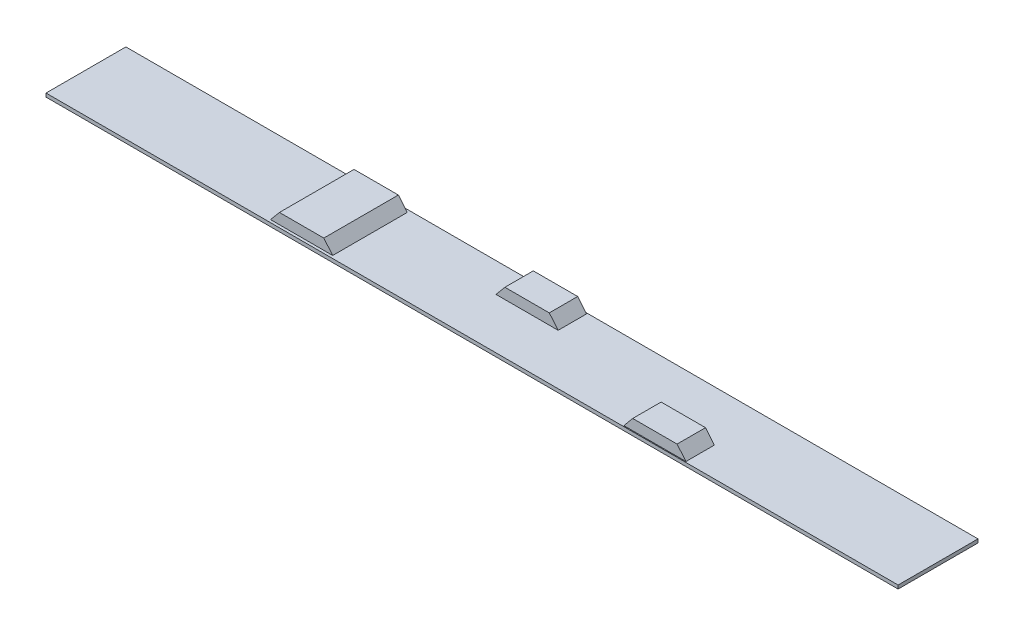
ISO-10303-21;
HEADER;
FILE_DESCRIPTION(('STEP AP214'),'2;1');
FILE_NAME('part.step','',(''),(''),'','','');
FILE_SCHEMA(('AUTOMOTIVE_DESIGN { 1 0 10303 214 1 1 1 1 }'));
ENDSEC;
DATA;
#1=APPLICATION_CONTEXT('core data for automotive mechanical design processes');
#2=APPLICATION_PROTOCOL_DEFINITION('international standard','automotive_design',2000,#1);
#3=PRODUCT_CONTEXT('',#1,'mechanical');
#4=PRODUCT('Part','Part','',(#3));
#5=PRODUCT_RELATED_PRODUCT_CATEGORY('part','',(#4));
#6=PRODUCT_DEFINITION_FORMATION('','',#4);
#7=PRODUCT_DEFINITION_CONTEXT('part definition',#1,'design');
#8=PRODUCT_DEFINITION('design','',#6,#7);
#9=PRODUCT_DEFINITION_SHAPE('','',#8);
#10=(LENGTH_UNIT() NAMED_UNIT(*) SI_UNIT(.MILLI.,.METRE.));
#11=(NAMED_UNIT(*) PLANE_ANGLE_UNIT() SI_UNIT($,.RADIAN.));
#12=(NAMED_UNIT(*) SI_UNIT($,.STERADIAN.) SOLID_ANGLE_UNIT());
#13=UNCERTAINTY_MEASURE_WITH_UNIT(LENGTH_MEASURE(1.E-05),#10,'distance_accuracy_value','');
#14=(GEOMETRIC_REPRESENTATION_CONTEXT(3) GLOBAL_UNCERTAINTY_ASSIGNED_CONTEXT((#13)) GLOBAL_UNIT_ASSIGNED_CONTEXT((#10,
#11,#12)) REPRESENTATION_CONTEXT('',''));
#15=CARTESIAN_POINT('',(0.,0.,0.));
#16=DIRECTION('',(0.,0.,1.));
#17=DIRECTION('',(1.,0.,0.));
#18=AXIS2_PLACEMENT_3D('',#15,#16,#17);
#19=CARTESIAN_POINT('',(0.,10.,0.));
#20=DIRECTION('',(0.,-1.,0.));
#21=DIRECTION('',(0.,0.,-1.));
#22=AXIS2_PLACEMENT_3D('',#19,#20,#21);
#23=PLANE('',#22);
#24=DIRECTION('',(1.,0.,0.));
#25=VECTOR('',#24,1.);
#26=CARTESIAN_POINT('',(425.,10.,110.));
#27=LINE('',#26,#25);
#28=CARTESIAN_POINT('',(425.,10.,110.));
#29=VERTEX_POINT('',#28);
#30=CARTESIAN_POINT('',(600.,10.,110.));
#31=VERTEX_POINT('',#30);
#32=EDGE_CURVE('E253',#29,#31,#27,.T.);
#33=ORIENTED_EDGE('',*,*,#32,.F.);
#34=DIRECTION('',(0.,0.,-1.));
#35=VECTOR('',#34,1.);
#36=CARTESIAN_POINT('',(425.,10.,110.));
#37=LINE('',#36,#35);
#38=CARTESIAN_POINT('',(425.,10.,30.));
#39=VERTEX_POINT('',#38);
#40=EDGE_CURVE('E267',#29,#39,#37,.T.);
#41=ORIENTED_EDGE('',*,*,#40,.T.);
#42=DIRECTION('',(1.,0.,0.));
#43=VECTOR('',#42,1.);
#44=CARTESIAN_POINT('',(425.,10.,30.));
#45=LINE('',#44,#43);
#46=CARTESIAN_POINT('',(600.,10.,30.));
#47=VERTEX_POINT('',#46);
#48=EDGE_CURVE('E244',#39,#47,#45,.T.);
#49=ORIENTED_EDGE('',*,*,#48,.T.);
#50=DIRECTION('',(0.,0.,-1.));
#51=VECTOR('',#50,1.);
#52=CARTESIAN_POINT('',(600.,10.,110.));
#53=LINE('',#52,#51);
#54=EDGE_CURVE('E290',#31,#47,#53,.T.);
#55=ORIENTED_EDGE('',*,*,#54,.F.);
#56=EDGE_LOOP('',(#33,#41,#49,#55));
#57=FACE_BOUND('',#56,.T.);
#58=DIRECTION('',(0.,0.,-1.));
#59=VECTOR('',#58,1.);
#60=CARTESIAN_POINT('',(1200.,10.,112.5));
#61=LINE('',#60,#59);
#62=CARTESIAN_POINT('',(1200.,10.,112.5));
#63=VERTEX_POINT('',#62);
#64=CARTESIAN_POINT('',(1200.,10.,-112.5));
#65=VERTEX_POINT('',#64);
#66=EDGE_CURVE('E294',#63,#65,#61,.T.);
#67=ORIENTED_EDGE('',*,*,#66,.T.);
#68=DIRECTION('',(-1.,0.,0.));
#69=VECTOR('',#68,1.);
#70=CARTESIAN_POINT('',(-1200.,10.,-112.5));
#71=LINE('',#70,#69);
#72=CARTESIAN_POINT('',(-1200.,10.,-112.5));
#73=VERTEX_POINT('',#72);
#74=EDGE_CURVE('E298',#65,#73,#71,.T.);
#75=ORIENTED_EDGE('',*,*,#74,.T.);
#76=DIRECTION('',(0.,0.,1.));
#77=VECTOR('',#76,1.);
#78=CARTESIAN_POINT('',(-1200.,10.,112.5));
#79=LINE('',#78,#77);
#80=CARTESIAN_POINT('',(-1200.,10.,112.5));
#81=VERTEX_POINT('',#80);
#82=EDGE_CURVE('E302',#73,#81,#79,.T.);
#83=ORIENTED_EDGE('',*,*,#82,.T.);
#84=DIRECTION('',(1.,0.,0.));
#85=VECTOR('',#84,1.);
#86=CARTESIAN_POINT('',(-1200.,10.,112.5));
#87=LINE('',#86,#85);
#88=EDGE_CURVE('E305',#81,#63,#87,.T.);
#89=ORIENTED_EDGE('',*,*,#88,.T.);
#90=EDGE_LOOP('',(#67,#75,#83,#89));
#91=FACE_BOUND('',#90,.T.);
#92=DIRECTION('',(0.,0.,1.));
#93=VECTOR('',#92,1.);
#94=CARTESIAN_POINT('',(-75.,9.99999999999651,-110.));
#95=LINE('',#94,#93);
#96=CARTESIAN_POINT('',(-74.9999999999971,10.,-110.));
#97=VERTEX_POINT('',#96);
#98=CARTESIAN_POINT('',(-75.,10.,-30.));
#99=VERTEX_POINT('',#98);
#100=EDGE_CURVE('E69',#97,#99,#95,.T.);
#101=ORIENTED_EDGE('',*,*,#100,.F.);
#102=DIRECTION('',(1.,0.,0.));
#103=VECTOR('',#102,1.);
#104=CARTESIAN_POINT('',(-75.,9.99999999999651,-110.));
#105=LINE('',#104,#103);
#106=CARTESIAN_POINT('',(99.9999999999971,10.,-110.));
#107=VERTEX_POINT('',#106);
#108=EDGE_CURVE('E215',#97,#107,#105,.T.);
#109=ORIENTED_EDGE('',*,*,#108,.T.);
#110=DIRECTION('',(0.,0.,1.));
#111=VECTOR('',#110,1.);
#112=CARTESIAN_POINT('',(100.,9.99999999999651,-110.));
#113=LINE('',#112,#111);
#114=CARTESIAN_POINT('',(100.,9.99999999999651,-30.));
#115=VERTEX_POINT('',#114);
#116=EDGE_CURVE('E248',#107,#115,#113,.T.);
#117=ORIENTED_EDGE('',*,*,#116,.T.);
#118=DIRECTION('',(1.,0.,0.));
#119=VECTOR('',#118,1.);
#120=CARTESIAN_POINT('',(-75.,9.99999999999651,-30.));
#121=LINE('',#120,#119);
#122=EDGE_CURVE('E230',#99,#115,#121,.T.);
#123=ORIENTED_EDGE('',*,*,#122,.F.);
#124=EDGE_LOOP('',(#101,#109,#117,#123));
#125=FACE_BOUND('',#124,.T.);
#126=DIRECTION('',(1.,0.,0.));
#127=VECTOR('',#126,1.);
#128=CARTESIAN_POINT('',(-575.,9.99999999999651,-105.));
#129=LINE('',#128,#127);
#130=CARTESIAN_POINT('',(-575.,9.99999999999651,-105.));
#131=VERTEX_POINT('',#130);
#132=CARTESIAN_POINT('',(-400.,9.99999999999302,-105.));
#133=VERTEX_POINT('',#132);
#134=EDGE_CURVE('E194',#131,#133,#129,.T.);
#135=ORIENTED_EDGE('',*,*,#134,.T.);
#136=DIRECTION('',(0.,0.,1.));
#137=VECTOR('',#136,1.);
#138=CARTESIAN_POINT('',(-400.,9.99999999999302,-105.));
#139=LINE('',#138,#137);
#140=CARTESIAN_POINT('',(-400.,9.99999999999302,105.));
#141=VERTEX_POINT('',#140);
#142=EDGE_CURVE('E205',#133,#141,#139,.T.);
#143=ORIENTED_EDGE('',*,*,#142,.T.);
#144=DIRECTION('',(1.,0.,0.));
#145=VECTOR('',#144,1.);
#146=CARTESIAN_POINT('',(-575.,9.99999999999651,105.));
#147=LINE('',#146,#145);
#148=CARTESIAN_POINT('',(-575.,10.,105.));
#149=VERTEX_POINT('',#148);
#150=EDGE_CURVE('E176',#149,#141,#147,.T.);
#151=ORIENTED_EDGE('',*,*,#150,.F.);
#152=DIRECTION('',(0.,0.,1.));
#153=VECTOR('',#152,1.);
#154=CARTESIAN_POINT('',(-575.,9.99999999999651,-105.));
#155=LINE('',#154,#153);
#156=EDGE_CURVE('E169',#131,#149,#155,.T.);
#157=ORIENTED_EDGE('',*,*,#156,.F.);
#158=EDGE_LOOP('',(#135,#143,#151,#157));
#159=FACE_BOUND('',#158,.T.);
#160=ADVANCED_FACE('F45',(#57,#91,#125,#159),#23,.F.);
#161=CARTESIAN_POINT('',(1200.,10.,112.5));
#162=DIRECTION('',(-1.,0.,0.));
#163=DIRECTION('',(0.,0.,1.));
#164=AXIS2_PLACEMENT_3D('',#161,#162,#163);
#165=PLANE('',#164);
#166=DIRECTION('',(0.,0.,-1.));
#167=VECTOR('',#166,1.);
#168=CARTESIAN_POINT('',(1200.,0.,112.5));
#169=LINE('',#168,#167);
#170=CARTESIAN_POINT('',(1200.,0.,112.5));
#171=VERTEX_POINT('',#170);
#172=CARTESIAN_POINT('',(1200.,0.,-112.5));
#173=VERTEX_POINT('',#172);
#174=EDGE_CURVE('E293',#171,#173,#169,.T.);
#175=ORIENTED_EDGE('',*,*,#174,.T.);
#176=DIRECTION('',(0.,-1.,0.));
#177=VECTOR('',#176,1.);
#178=CARTESIAN_POINT('',(1200.,10.,-112.5));
#179=LINE('',#178,#177);
#180=EDGE_CURVE('E11',#65,#173,#179,.T.);
#181=ORIENTED_EDGE('',*,*,#180,.F.);
#182=ORIENTED_EDGE('',*,*,#66,.F.);
#183=DIRECTION('',(0.,-1.,0.));
#184=VECTOR('',#183,1.);
#185=CARTESIAN_POINT('',(1200.,10.,112.5));
#186=LINE('',#185,#184);
#187=EDGE_CURVE('E308',#63,#171,#186,.T.);
#188=ORIENTED_EDGE('',*,*,#187,.T.);
#189=EDGE_LOOP('',(#175,#181,#182,#188));
#190=FACE_BOUND('',#189,.T.);
#191=ADVANCED_FACE('F47',(#190),#165,.F.);
#192=CARTESIAN_POINT('',(-1200.,10.,-112.5));
#193=DIRECTION('',(0.,0.,1.));
#194=DIRECTION('',(1.,0.,0.));
#195=AXIS2_PLACEMENT_3D('',#192,#193,#194);
#196=PLANE('',#195);
#197=DIRECTION('',(-1.,0.,0.));
#198=VECTOR('',#197,1.);
#199=CARTESIAN_POINT('',(-1200.,0.,-112.5));
#200=LINE('',#199,#198);
#201=CARTESIAN_POINT('',(-1200.,0.,-112.5));
#202=VERTEX_POINT('',#201);
#203=EDGE_CURVE('E312',#173,#202,#200,.T.);
#204=ORIENTED_EDGE('',*,*,#203,.T.);
#205=DIRECTION('',(0.,-1.,0.));
#206=VECTOR('',#205,1.);
#207=CARTESIAN_POINT('',(-1200.,10.,-112.5));
#208=LINE('',#207,#206);
#209=EDGE_CURVE('E54',#73,#202,#208,.T.);
#210=ORIENTED_EDGE('',*,*,#209,.F.);
#211=ORIENTED_EDGE('',*,*,#74,.F.);
#212=ORIENTED_EDGE('',*,*,#180,.T.);
#213=EDGE_LOOP('',(#204,#210,#211,#212));
#214=FACE_BOUND('',#213,.T.);
#215=ADVANCED_FACE('F347',(#214),#196,.F.);
#216=CARTESIAN_POINT('',(-1200.,10.,112.5));
#217=DIRECTION('',(1.,0.,0.));
#218=DIRECTION('',(0.,0.,-1.));
#219=AXIS2_PLACEMENT_3D('',#216,#217,#218);
#220=PLANE('',#219);
#221=DIRECTION('',(0.,0.,1.));
#222=VECTOR('',#221,1.);
#223=CARTESIAN_POINT('',(-1200.,0.,112.5));
#224=LINE('',#223,#222);
#225=CARTESIAN_POINT('',(-1200.,0.,112.5));
#226=VERTEX_POINT('',#225);
#227=EDGE_CURVE('E315',#202,#226,#224,.T.);
#228=ORIENTED_EDGE('',*,*,#227,.T.);
#229=DIRECTION('',(0.,-1.,0.));
#230=VECTOR('',#229,1.);
#231=CARTESIAN_POINT('',(-1200.,10.,112.5));
#232=LINE('',#231,#230);
#233=EDGE_CURVE('E323',#81,#226,#232,.T.);
#234=ORIENTED_EDGE('',*,*,#233,.F.);
#235=ORIENTED_EDGE('',*,*,#82,.F.);
#236=ORIENTED_EDGE('',*,*,#209,.T.);
#237=EDGE_LOOP('',(#228,#234,#235,#236));
#238=FACE_BOUND('',#237,.T.);
#239=ADVANCED_FACE('F332',(#238),#220,.F.);
#240=CARTESIAN_POINT('',(-1200.,10.,112.5));
#241=DIRECTION('',(0.,0.,-1.));
#242=DIRECTION('',(-1.,0.,0.));
#243=AXIS2_PLACEMENT_3D('',#240,#241,#242);
#244=PLANE('',#243);
#245=DIRECTION('',(1.,0.,0.));
#246=VECTOR('',#245,1.);
#247=CARTESIAN_POINT('',(-1200.,0.,112.5));
#248=LINE('',#247,#246);
#249=EDGE_CURVE('E299',#226,#171,#248,.T.);
#250=ORIENTED_EDGE('',*,*,#249,.T.);
#251=ORIENTED_EDGE('',*,*,#187,.F.);
#252=ORIENTED_EDGE('',*,*,#88,.F.);
#253=ORIENTED_EDGE('',*,*,#233,.T.);
#254=EDGE_LOOP('',(#250,#251,#252,#253));
#255=FACE_BOUND('',#254,.T.);
#256=ADVANCED_FACE('F341',(#255),#244,.F.);
#257=CARTESIAN_POINT('',(0.,0.,0.));
#258=DIRECTION('',(0.,-1.,0.));
#259=DIRECTION('',(0.,0.,-1.));
#260=AXIS2_PLACEMENT_3D('',#257,#258,#259);
#261=PLANE('',#260);
#262=ORIENTED_EDGE('',*,*,#174,.F.);
#263=ORIENTED_EDGE('',*,*,#249,.F.);
#264=ORIENTED_EDGE('',*,*,#227,.F.);
#265=ORIENTED_EDGE('',*,*,#203,.F.);
#266=EDGE_LOOP('',(#262,#263,#264,#265));
#267=FACE_BOUND('',#266,.T.);
#268=ADVANCED_FACE('F338',(#267),#261,.T.);
#269=CARTESIAN_POINT('',(575.,40.,110.));
#270=DIRECTION('',(-0.768221279597376,-0.64018439966448,0.));
#271=DIRECTION('',(0.64018439966448,-0.768221279597376,0.));
#272=AXIS2_PLACEMENT_3D('',#269,#270,#271);
#273=PLANE('',#272);
#274=DIRECTION('',(-0.64018439966448,0.768221279597375,0.));
#275=VECTOR('',#274,1.);
#276=CARTESIAN_POINT('',(575.,40.,30.));
#277=LINE('',#276,#275);
#278=CARTESIAN_POINT('',(575.,40.,30.));
#279=VERTEX_POINT('',#278);
#280=EDGE_CURVE('E271',#47,#279,#277,.T.);
#281=ORIENTED_EDGE('',*,*,#280,.T.);
#282=DIRECTION('',(0.,0.,-1.));
#283=VECTOR('',#282,1.);
#284=CARTESIAN_POINT('',(575.,40.,110.));
#285=LINE('',#284,#283);
#286=CARTESIAN_POINT('',(575.,40.,110.));
#287=VERTEX_POINT('',#286);
#288=EDGE_CURVE('E286',#287,#279,#285,.T.);
#289=ORIENTED_EDGE('',*,*,#288,.F.);
#290=DIRECTION('',(-0.64018439966448,0.768221279597375,0.));
#291=VECTOR('',#290,1.);
#292=CARTESIAN_POINT('',(575.,40.,110.));
#293=LINE('',#292,#291);
#294=EDGE_CURVE('E257',#31,#287,#293,.T.);
#295=ORIENTED_EDGE('',*,*,#294,.F.);
#296=ORIENTED_EDGE('',*,*,#54,.T.);
#297=EDGE_LOOP('',(#281,#289,#295,#296));
#298=FACE_BOUND('',#297,.T.);
#299=ADVANCED_FACE('F362',(#298),#273,.F.);
#300=CARTESIAN_POINT('',(450.,40.,110.));
#301=DIRECTION('',(0.,-1.,0.));
#302=DIRECTION('',(0.,0.,-1.));
#303=AXIS2_PLACEMENT_3D('',#300,#301,#302);
#304=PLANE('',#303);
#305=DIRECTION('',(-1.,0.,0.));
#306=VECTOR('',#305,1.);
#307=CARTESIAN_POINT('',(450.,40.,30.));
#308=LINE('',#307,#306);
#309=CARTESIAN_POINT('',(450.,40.,30.));
#310=VERTEX_POINT('',#309);
#311=EDGE_CURVE('E274',#279,#310,#308,.T.);
#312=ORIENTED_EDGE('',*,*,#311,.T.);
#313=DIRECTION('',(0.,0.,-1.));
#314=VECTOR('',#313,1.);
#315=CARTESIAN_POINT('',(450.,40.,110.));
#316=LINE('',#315,#314);
#317=CARTESIAN_POINT('',(450.,40.,110.));
#318=VERTEX_POINT('',#317);
#319=EDGE_CURVE('E282',#318,#310,#316,.T.);
#320=ORIENTED_EDGE('',*,*,#319,.F.);
#321=DIRECTION('',(-1.,0.,0.));
#322=VECTOR('',#321,1.);
#323=CARTESIAN_POINT('',(450.,40.,110.));
#324=LINE('',#323,#322);
#325=EDGE_CURVE('E261',#287,#318,#324,.T.);
#326=ORIENTED_EDGE('',*,*,#325,.F.);
#327=ORIENTED_EDGE('',*,*,#288,.T.);
#328=EDGE_LOOP('',(#312,#320,#326,#327));
#329=FACE_BOUND('',#328,.T.);
#330=ADVANCED_FACE('F381',(#329),#304,.F.);
#331=CARTESIAN_POINT('',(425.,10.,110.));
#332=DIRECTION('',(0.768221279597376,-0.640184399664479,0.));
#333=DIRECTION('',(0.640184399664479,0.768221279597376,0.));
#334=AXIS2_PLACEMENT_3D('',#331,#332,#333);
#335=PLANE('',#334);
#336=DIRECTION('',(-0.640184399664479,-0.768221279597376,0.));
#337=VECTOR('',#336,1.);
#338=CARTESIAN_POINT('',(425.,10.,30.));
#339=LINE('',#338,#337);
#340=EDGE_CURVE('E258',#310,#39,#339,.T.);
#341=ORIENTED_EDGE('',*,*,#340,.T.);
#342=ORIENTED_EDGE('',*,*,#40,.F.);
#343=DIRECTION('',(-0.640184399664479,-0.768221279597376,0.));
#344=VECTOR('',#343,1.);
#345=CARTESIAN_POINT('',(425.,10.,110.));
#346=LINE('',#345,#344);
#347=EDGE_CURVE('E264',#318,#29,#346,.T.);
#348=ORIENTED_EDGE('',*,*,#347,.F.);
#349=ORIENTED_EDGE('',*,*,#319,.T.);
#350=EDGE_LOOP('',(#341,#342,#348,#349));
#351=FACE_BOUND('',#350,.T.);
#352=ADVANCED_FACE('F388',(#351),#335,.F.);
#353=CARTESIAN_POINT('',(0.,0.,110.));
#354=DIRECTION('',(0.,0.,-1.));
#355=DIRECTION('',(-1.,0.,0.));
#356=AXIS2_PLACEMENT_3D('',#353,#354,#355);
#357=PLANE('',#356);
#358=ORIENTED_EDGE('',*,*,#32,.T.);
#359=ORIENTED_EDGE('',*,*,#294,.T.);
#360=ORIENTED_EDGE('',*,*,#325,.T.);
#361=ORIENTED_EDGE('',*,*,#347,.T.);
#362=EDGE_LOOP('',(#358,#359,#360,#361));
#363=FACE_BOUND('',#362,.T.);
#364=ADVANCED_FACE('F395',(#363),#357,.F.);
#365=CARTESIAN_POINT('',(0.,0.,30.));
#366=DIRECTION('',(0.,0.,-1.));
#367=DIRECTION('',(-1.,0.,0.));
#368=AXIS2_PLACEMENT_3D('',#365,#366,#367);
#369=PLANE('',#368);
#370=ORIENTED_EDGE('',*,*,#48,.F.);
#371=ORIENTED_EDGE('',*,*,#340,.F.);
#372=ORIENTED_EDGE('',*,*,#311,.F.);
#373=ORIENTED_EDGE('',*,*,#280,.F.);
#374=EDGE_LOOP('',(#370,#371,#372,#373));
#375=FACE_BOUND('',#374,.T.);
#376=ADVANCED_FACE('F403',(#375),#369,.T.);
#377=CARTESIAN_POINT('',(-50.,39.9999999999965,-110.));
#378=DIRECTION('',(-0.768221279597376,0.640184399664479,0.));
#379=DIRECTION('',(-0.640184399664479,-0.768221279597376,0.));
#380=AXIS2_PLACEMENT_3D('',#377,#378,#379);
#381=PLANE('',#380);
#382=DIRECTION('',(-0.640184399664479,-0.768221279597376,0.));
#383=VECTOR('',#382,1.);
#384=CARTESIAN_POINT('',(-50.,39.9999999999965,-30.));
#385=LINE('',#384,#383);
#386=CARTESIAN_POINT('',(-50.,39.9999999999965,-30.));
#387=VERTEX_POINT('',#386);
#388=EDGE_CURVE('E204',#387,#99,#385,.T.);
#389=ORIENTED_EDGE('',*,*,#388,.F.);
#390=DIRECTION('',(0.,0.,1.));
#391=VECTOR('',#390,1.);
#392=CARTESIAN_POINT('',(-50.,39.9999999999965,-110.));
#393=LINE('',#392,#391);
#394=CARTESIAN_POINT('',(-50.,39.9999999999965,-110.));
#395=VERTEX_POINT('',#394);
#396=EDGE_CURVE('E241',#395,#387,#393,.T.);
#397=ORIENTED_EDGE('',*,*,#396,.F.);
#398=DIRECTION('',(-0.640184399664479,-0.768221279597376,0.));
#399=VECTOR('',#398,1.);
#400=CARTESIAN_POINT('',(-50.,39.9999999999965,-110.));
#401=LINE('',#400,#399);
#402=EDGE_CURVE('E211',#395,#97,#401,.T.);
#403=ORIENTED_EDGE('',*,*,#402,.T.);
#404=ORIENTED_EDGE('',*,*,#100,.T.);
#405=EDGE_LOOP('',(#389,#397,#403,#404));
#406=FACE_BOUND('',#405,.T.);
#407=ADVANCED_FACE('F411',(#406),#381,.T.);
#408=CARTESIAN_POINT('',(75.,39.9999999999965,-110.));
#409=DIRECTION('',(0.,1.,0.));
#410=DIRECTION('',(0.,0.,1.));
#411=AXIS2_PLACEMENT_3D('',#408,#409,#410);
#412=PLANE('',#411);
#413=DIRECTION('',(-1.,0.,0.));
#414=VECTOR('',#413,1.);
#415=CARTESIAN_POINT('',(75.,39.9999999999965,-30.));
#416=LINE('',#415,#414);
#417=CARTESIAN_POINT('',(75.,39.9999999999965,-30.));
#418=VERTEX_POINT('',#417);
#419=EDGE_CURVE('E216',#418,#387,#416,.T.);
#420=ORIENTED_EDGE('',*,*,#419,.F.);
#421=DIRECTION('',(0.,0.,1.));
#422=VECTOR('',#421,1.);
#423=CARTESIAN_POINT('',(75.,39.9999999999965,-110.));
#424=LINE('',#423,#422);
#425=CARTESIAN_POINT('',(75.,39.9999999999965,-110.));
#426=VERTEX_POINT('',#425);
#427=EDGE_CURVE('E245',#426,#418,#424,.T.);
#428=ORIENTED_EDGE('',*,*,#427,.F.);
#429=DIRECTION('',(-1.,0.,0.));
#430=VECTOR('',#429,1.);
#431=CARTESIAN_POINT('',(75.,39.9999999999965,-110.));
#432=LINE('',#431,#430);
#433=EDGE_CURVE('E223',#426,#395,#432,.T.);
#434=ORIENTED_EDGE('',*,*,#433,.T.);
#435=ORIENTED_EDGE('',*,*,#396,.T.);
#436=EDGE_LOOP('',(#420,#428,#434,#435));
#437=FACE_BOUND('',#436,.T.);
#438=ADVANCED_FACE('F419',(#437),#412,.T.);
#439=CARTESIAN_POINT('',(100.,9.99999999999651,-110.));
#440=DIRECTION('',(0.768221279597376,0.64018439966448,0.));
#441=DIRECTION('',(-0.64018439966448,0.768221279597376,0.));
#442=AXIS2_PLACEMENT_3D('',#439,#440,#441);
#443=PLANE('',#442);
#444=DIRECTION('',(-0.64018439966448,0.768221279597375,0.));
#445=VECTOR('',#444,1.);
#446=CARTESIAN_POINT('',(100.,9.99999999999651,-30.));
#447=LINE('',#446,#445);
#448=EDGE_CURVE('E234',#115,#418,#447,.T.);
#449=ORIENTED_EDGE('',*,*,#448,.F.);
#450=ORIENTED_EDGE('',*,*,#116,.F.);
#451=DIRECTION('',(-0.64018439966448,0.768221279597375,0.));
#452=VECTOR('',#451,1.);
#453=CARTESIAN_POINT('',(100.,9.99999999999651,-110.));
#454=LINE('',#453,#452);
#455=EDGE_CURVE('E219',#107,#426,#454,.T.);
#456=ORIENTED_EDGE('',*,*,#455,.T.);
#457=ORIENTED_EDGE('',*,*,#427,.T.);
#458=EDGE_LOOP('',(#449,#450,#456,#457));
#459=FACE_BOUND('',#458,.T.);
#460=ADVANCED_FACE('F427',(#459),#443,.T.);
#461=CARTESIAN_POINT('',(0.,0.,-110.));
#462=DIRECTION('',(0.,0.,-1.));
#463=DIRECTION('',(-1.,0.,0.));
#464=AXIS2_PLACEMENT_3D('',#461,#462,#463);
#465=PLANE('',#464);
#466=ORIENTED_EDGE('',*,*,#402,.F.);
#467=ORIENTED_EDGE('',*,*,#433,.F.);
#468=ORIENTED_EDGE('',*,*,#455,.F.);
#469=ORIENTED_EDGE('',*,*,#108,.F.);
#470=EDGE_LOOP('',(#466,#467,#468,#469));
#471=FACE_BOUND('',#470,.T.);
#472=ADVANCED_FACE('F435',(#471),#465,.T.);
#473=CARTESIAN_POINT('',(0.,0.,-30.));
#474=DIRECTION('',(0.,0.,-1.));
#475=DIRECTION('',(-1.,0.,0.));
#476=AXIS2_PLACEMENT_3D('',#473,#474,#475);
#477=PLANE('',#476);
#478=ORIENTED_EDGE('',*,*,#388,.T.);
#479=ORIENTED_EDGE('',*,*,#122,.T.);
#480=ORIENTED_EDGE('',*,*,#448,.T.);
#481=ORIENTED_EDGE('',*,*,#419,.T.);
#482=EDGE_LOOP('',(#478,#479,#480,#481));
#483=FACE_BOUND('',#482,.T.);
#484=ADVANCED_FACE('F443',(#483),#477,.F.);
#485=CARTESIAN_POINT('',(-425.,39.999999999993,-105.));
#486=DIRECTION('',(0.,1.,0.));
#487=DIRECTION('',(0.,0.,1.));
#488=AXIS2_PLACEMENT_3D('',#485,#486,#487);
#489=PLANE('',#488);
#490=DIRECTION('',(0.,0.,1.));
#491=VECTOR('',#490,1.);
#492=CARTESIAN_POINT('',(-550.,39.999999999993,-105.));
#493=LINE('',#492,#491);
#494=CARTESIAN_POINT('',(-550.,39.999999999993,-105.));
#495=VERTEX_POINT('',#494);
#496=CARTESIAN_POINT('',(-550.,39.999999999993,105.));
#497=VERTEX_POINT('',#496);
#498=EDGE_CURVE('E160',#495,#497,#493,.T.);
#499=ORIENTED_EDGE('',*,*,#498,.T.);
#500=DIRECTION('',(-1.,0.,0.));
#501=VECTOR('',#500,1.);
#502=CARTESIAN_POINT('',(-425.,39.999999999993,105.));
#503=LINE('',#502,#501);
#504=CARTESIAN_POINT('',(-425.,39.999999999993,105.));
#505=VERTEX_POINT('',#504);
#506=EDGE_CURVE('E162',#505,#497,#503,.T.);
#507=ORIENTED_EDGE('',*,*,#506,.F.);
#508=DIRECTION('',(0.,0.,1.));
#509=VECTOR('',#508,1.);
#510=CARTESIAN_POINT('',(-425.,39.999999999993,-105.));
#511=LINE('',#510,#509);
#512=CARTESIAN_POINT('',(-425.,39.999999999993,-105.));
#513=VERTEX_POINT('',#512);
#514=EDGE_CURVE('E201',#513,#505,#511,.T.);
#515=ORIENTED_EDGE('',*,*,#514,.F.);
#516=DIRECTION('',(-1.,0.,0.));
#517=VECTOR('',#516,1.);
#518=CARTESIAN_POINT('',(-425.,39.999999999993,-105.));
#519=LINE('',#518,#517);
#520=EDGE_CURVE('E164',#513,#495,#519,.T.);
#521=ORIENTED_EDGE('',*,*,#520,.T.);
#522=EDGE_LOOP('',(#499,#507,#515,#521));
#523=FACE_BOUND('',#522,.T.);
#524=ADVANCED_FACE('F161',(#523),#489,.T.);
#525=CARTESIAN_POINT('',(-400.,9.99999999999302,-105.));
#526=DIRECTION('',(0.768221279597376,0.64018439966448,0.));
#527=DIRECTION('',(-0.64018439966448,0.768221279597376,0.));
#528=AXIS2_PLACEMENT_3D('',#525,#526,#527);
#529=PLANE('',#528);
#530=ORIENTED_EDGE('',*,*,#514,.T.);
#531=DIRECTION('',(-0.64018439966448,0.768221279597376,0.));
#532=VECTOR('',#531,1.);
#533=CARTESIAN_POINT('',(-400.,9.99999999999302,105.));
#534=LINE('',#533,#532);
#535=EDGE_CURVE('E181',#141,#505,#534,.T.);
#536=ORIENTED_EDGE('',*,*,#535,.F.);
#537=ORIENTED_EDGE('',*,*,#142,.F.);
#538=DIRECTION('',(-0.64018439966448,0.768221279597376,0.));
#539=VECTOR('',#538,1.);
#540=CARTESIAN_POINT('',(-400.,9.99999999999302,-105.));
#541=LINE('',#540,#539);
#542=EDGE_CURVE('E170',#133,#513,#541,.T.);
#543=ORIENTED_EDGE('',*,*,#542,.T.);
#544=EDGE_LOOP('',(#530,#536,#537,#543));
#545=FACE_BOUND('',#544,.T.);
#546=ADVANCED_FACE('F458',(#545),#529,.T.);
#547=CARTESIAN_POINT('',(-550.,39.999999999993,-105.));
#548=DIRECTION('',(-0.76822127959734,0.640184399664522,0.));
#549=DIRECTION('',(-0.640184399664522,-0.76822127959734,0.));
#550=AXIS2_PLACEMENT_3D('',#547,#548,#549);
#551=PLANE('',#550);
#552=ORIENTED_EDGE('',*,*,#156,.T.);
#553=DIRECTION('',(-0.640184399664522,-0.76822127959734,0.));
#554=VECTOR('',#553,1.);
#555=CARTESIAN_POINT('',(-550.,39.999999999993,105.));
#556=LINE('',#555,#554);
#557=EDGE_CURVE('E61',#497,#149,#556,.T.);
#558=ORIENTED_EDGE('',*,*,#557,.F.);
#559=ORIENTED_EDGE('',*,*,#498,.F.);
#560=DIRECTION('',(-0.640184399664522,-0.76822127959734,0.));
#561=VECTOR('',#560,1.);
#562=CARTESIAN_POINT('',(-550.,39.999999999993,-105.));
#563=LINE('',#562,#561);
#564=EDGE_CURVE('E191',#495,#131,#563,.T.);
#565=ORIENTED_EDGE('',*,*,#564,.T.);
#566=EDGE_LOOP('',(#552,#558,#559,#565));
#567=FACE_BOUND('',#566,.T.);
#568=ADVANCED_FACE('F172',(#567),#551,.T.);
#569=CARTESIAN_POINT('',(0.,0.,-105.));
#570=DIRECTION('',(0.,0.,1.));
#571=DIRECTION('',(1.,0.,0.));
#572=AXIS2_PLACEMENT_3D('',#569,#570,#571);
#573=PLANE('',#572);
#574=ORIENTED_EDGE('',*,*,#520,.F.);
#575=ORIENTED_EDGE('',*,*,#542,.F.);
#576=ORIENTED_EDGE('',*,*,#134,.F.);
#577=ORIENTED_EDGE('',*,*,#564,.F.);
#578=EDGE_LOOP('',(#574,#575,#576,#577));
#579=FACE_BOUND('',#578,.T.);
#580=ADVANCED_FACE('F472',(#579),#573,.F.);
#581=CARTESIAN_POINT('',(0.,0.,105.));
#582=DIRECTION('',(0.,0.,1.));
#583=DIRECTION('',(1.,0.,0.));
#584=AXIS2_PLACEMENT_3D('',#581,#582,#583);
#585=PLANE('',#584);
#586=ORIENTED_EDGE('',*,*,#506,.T.);
#587=ORIENTED_EDGE('',*,*,#557,.T.);
#588=ORIENTED_EDGE('',*,*,#150,.T.);
#589=ORIENTED_EDGE('',*,*,#535,.T.);
#590=EDGE_LOOP('',(#586,#587,#588,#589));
#591=FACE_BOUND('',#590,.T.);
#592=ADVANCED_FACE('F179',(#591),#585,.T.);
#593=CLOSED_SHELL('',(#160,#191,#215,#239,#256,#268,#299,#330,#352,#364,#376,#407,#438,#460,
#472,#484,#524,#546,#568,#580,#592));
#594=MANIFOLD_SOLID_BREP('B2',#593);
#595=ADVANCED_BREP_SHAPE_REPRESENTATION('',(#18,#594),#14);
#596=SHAPE_DEFINITION_REPRESENTATION(#9,#595);
ENDSEC;
END-ISO-10303-21;
